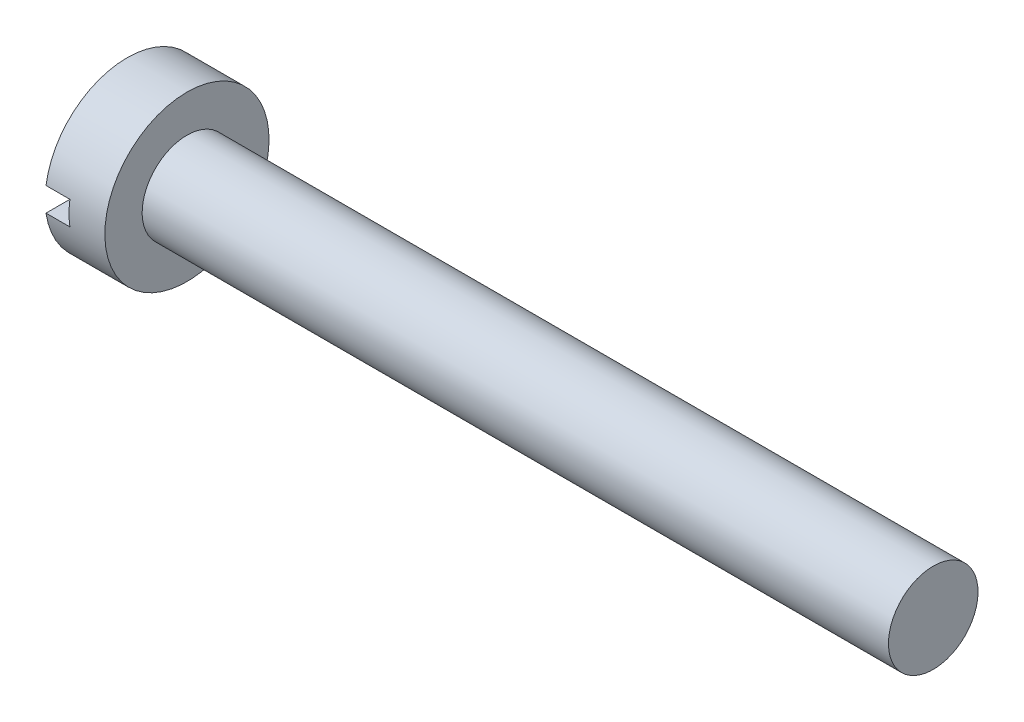
ISO-10303-21;
HEADER;
FILE_DESCRIPTION(('STEP AP214'),'2;1');
FILE_NAME('part.step','',(''),(''),'','','');
FILE_SCHEMA(('AUTOMOTIVE_DESIGN { 1 0 10303 214 1 1 1 1 }'));
ENDSEC;
DATA;
#1=APPLICATION_CONTEXT('core data for automotive mechanical design processes');
#2=APPLICATION_PROTOCOL_DEFINITION('international standard','automotive_design',2000,#1);
#3=PRODUCT_CONTEXT('',#1,'mechanical');
#4=PRODUCT('Part','Part','',(#3));
#5=PRODUCT_RELATED_PRODUCT_CATEGORY('part','',(#4));
#6=PRODUCT_DEFINITION_FORMATION('','',#4);
#7=PRODUCT_DEFINITION_CONTEXT('part definition',#1,'design');
#8=PRODUCT_DEFINITION('design','',#6,#7);
#9=PRODUCT_DEFINITION_SHAPE('','',#8);
#10=(LENGTH_UNIT() NAMED_UNIT(*) SI_UNIT(.MILLI.,.METRE.));
#11=(NAMED_UNIT(*) PLANE_ANGLE_UNIT() SI_UNIT($,.RADIAN.));
#12=(NAMED_UNIT(*) SI_UNIT($,.STERADIAN.) SOLID_ANGLE_UNIT());
#13=UNCERTAINTY_MEASURE_WITH_UNIT(LENGTH_MEASURE(1.E-05),#10,'distance_accuracy_value','');
#14=(GEOMETRIC_REPRESENTATION_CONTEXT(3) GLOBAL_UNCERTAINTY_ASSIGNED_CONTEXT((#13)) GLOBAL_UNIT_ASSIGNED_CONTEXT((#10,
#11,#12)) REPRESENTATION_CONTEXT('',''));
#15=CARTESIAN_POINT('',(0.,0.,0.));
#16=DIRECTION('',(0.,0.,1.));
#17=DIRECTION('',(1.,0.,0.));
#18=AXIS2_PLACEMENT_3D('',#15,#16,#17);
#19=CARTESIAN_POINT('',(0.,0.,0.));
#20=DIRECTION('',(-1.,0.,0.));
#21=DIRECTION('',(0.,-1.,0.));
#22=AXIS2_PLACEMENT_3D('',#19,#20,#21);
#23=PLANE('',#22);
#24=DIRECTION('',(0.,0.,-1.));
#25=VECTOR('',#24,1.);
#26=CARTESIAN_POINT('',(0.,0.399999999999997,-2.75));
#27=LINE('',#26,#25);
#28=CARTESIAN_POINT('',(0.,0.399999999999999,2.72075357208256));
#29=VERTEX_POINT('',#28);
#30=CARTESIAN_POINT('',(0.,0.399999999999997,-2.72075357208256));
#31=VERTEX_POINT('',#30);
#32=EDGE_CURVE('E83',#29,#31,#27,.T.);
#33=ORIENTED_EDGE('',*,*,#32,.F.);
#34=CARTESIAN_POINT('',(0.,0.,0.));
#35=DIRECTION('',(1.,0.,0.));
#36=DIRECTION('',(0.,1.,0.));
#37=AXIS2_PLACEMENT_3D('',#34,#35,#36);
#38=CIRCLE('',#37,2.75);
#39=EDGE_CURVE('E89',#31,#29,#38,.T.);
#40=ORIENTED_EDGE('',*,*,#39,.F.);
#41=EDGE_LOOP('',(#33,#40));
#42=FACE_BOUND('',#41,.T.);
#43=ADVANCED_FACE('F33',(#42),#23,.T.);
#44=DIRECTION('',(0.,0.,1.));
#45=VECTOR('',#44,1.);
#46=CARTESIAN_POINT('',(0.,-0.400000000000001,-2.75));
#47=LINE('',#46,#45);
#48=CARTESIAN_POINT('',(0.,-0.400000000000001,-2.72075357208256));
#49=VERTEX_POINT('',#48);
#50=CARTESIAN_POINT('',(0.,-0.399999999999999,2.72075357208256));
#51=VERTEX_POINT('',#50);
#52=EDGE_CURVE('E77',#49,#51,#47,.T.);
#53=ORIENTED_EDGE('',*,*,#52,.F.);
#54=EDGE_CURVE('E82',#51,#49,#38,.T.);
#55=ORIENTED_EDGE('',*,*,#54,.F.);
#56=EDGE_LOOP('',(#53,#55));
#57=FACE_BOUND('',#56,.T.);
#58=ADVANCED_FACE('F35',(#57),#23,.T.);
#59=CARTESIAN_POINT('',(27.,0.,0.));
#60=DIRECTION('',(1.,0.,0.));
#61=DIRECTION('',(0.,1.,0.));
#62=AXIS2_PLACEMENT_3D('',#59,#60,#61);
#63=CYLINDRICAL_SURFACE('',#62,2.75);
#64=DIRECTION('',(1.,0.,0.));
#65=VECTOR('',#64,1.);
#66=CARTESIAN_POINT('',(27.,0.399999999999997,-2.72075357208256));
#67=LINE('',#66,#65);
#68=CARTESIAN_POINT('',(0.799999999999999,0.399999999999997,-2.72075357208256));
#69=VERTEX_POINT('',#68);
#70=EDGE_CURVE('E11',#31,#69,#67,.T.);
#71=ORIENTED_EDGE('',*,*,#70,.F.);
#72=ORIENTED_EDGE('',*,*,#39,.T.);
#73=DIRECTION('',(1.,0.,0.));
#74=VECTOR('',#73,1.);
#75=CARTESIAN_POINT('',(27.,0.399999999999999,2.72075357208256));
#76=LINE('',#75,#74);
#77=CARTESIAN_POINT('',(0.799999999999999,0.399999999999999,2.72075357208256));
#78=VERTEX_POINT('',#77);
#79=EDGE_CURVE('E98',#78,#29,#76,.F.);
#80=ORIENTED_EDGE('',*,*,#79,.F.);
#81=CARTESIAN_POINT('',(0.799999999999999,0.,0.));
#82=DIRECTION('',(-1.,0.,0.));
#83=DIRECTION('',(0.,0.,1.));
#84=AXIS2_PLACEMENT_3D('',#81,#82,#83);
#85=CIRCLE('',#84,2.75);
#86=CARTESIAN_POINT('',(0.799999999999999,-0.399999999999999,2.72075357208256));
#87=VERTEX_POINT('',#86);
#88=EDGE_CURVE('E48',#78,#87,#85,.F.);
#89=ORIENTED_EDGE('',*,*,#88,.T.);
#90=DIRECTION('',(1.,0.,0.));
#91=VECTOR('',#90,1.);
#92=CARTESIAN_POINT('',(27.,-0.399999999999999,2.72075357208256));
#93=LINE('',#92,#91);
#94=EDGE_CURVE('E88',#51,#87,#93,.T.);
#95=ORIENTED_EDGE('',*,*,#94,.F.);
#96=ORIENTED_EDGE('',*,*,#54,.T.);
#97=DIRECTION('',(1.,0.,0.));
#98=VECTOR('',#97,1.);
#99=CARTESIAN_POINT('',(27.,-0.400000000000001,-2.72075357208256));
#100=LINE('',#99,#98);
#101=CARTESIAN_POINT('',(0.799999999999999,-0.400000000000001,-2.72075357208256));
#102=VERTEX_POINT('',#101);
#103=EDGE_CURVE('E41',#102,#49,#100,.F.);
#104=ORIENTED_EDGE('',*,*,#103,.F.);
#105=EDGE_CURVE('E56',#102,#69,#85,.F.);
#106=ORIENTED_EDGE('',*,*,#105,.T.);
#107=EDGE_LOOP('',(#71,#72,#80,#89,#95,#96,#104,#106));
#108=FACE_BOUND('',#107,.T.);
#109=CARTESIAN_POINT('',(2.,0.,0.));
#110=DIRECTION('',(1.,0.,0.));
#111=DIRECTION('',(0.,1.,0.));
#112=AXIS2_PLACEMENT_3D('',#109,#110,#111);
#113=CIRCLE('',#112,2.75);
#114=CARTESIAN_POINT('',(2.,2.75,0.));
#115=VERTEX_POINT('',#114);
#116=EDGE_CURVE('E93',#115,#115,#113,.T.);
#117=ORIENTED_EDGE('',*,*,#116,.F.);
#118=EDGE_LOOP('',(#117));
#119=FACE_BOUND('',#118,.T.);
#120=ADVANCED_FACE('F86',(#108,#119),#63,.T.);
#121=CARTESIAN_POINT('',(2.,2.75,0.));
#122=DIRECTION('',(1.,0.,0.));
#123=DIRECTION('',(0.,1.,0.));
#124=AXIS2_PLACEMENT_3D('',#121,#122,#123);
#125=PLANE('',#124);
#126=ORIENTED_EDGE('',*,*,#116,.T.);
#127=EDGE_LOOP('',(#126));
#128=FACE_BOUND('',#127,.T.);
#129=CARTESIAN_POINT('',(2.,0.,0.));
#130=DIRECTION('',(1.,0.,0.));
#131=DIRECTION('',(0.,1.,0.));
#132=AXIS2_PLACEMENT_3D('',#129,#130,#131);
#133=CIRCLE('',#132,1.5);
#134=CARTESIAN_POINT('',(2.,1.5,0.));
#135=VERTEX_POINT('',#134);
#136=EDGE_CURVE('E111',#135,#135,#133,.T.);
#137=ORIENTED_EDGE('',*,*,#136,.F.);
#138=EDGE_LOOP('',(#137));
#139=FACE_BOUND('',#138,.T.);
#140=ADVANCED_FACE('F118',(#128,#139),#125,.T.);
#141=CARTESIAN_POINT('',(27.,0.,0.));
#142=DIRECTION('',(1.,0.,0.));
#143=DIRECTION('',(0.,1.,0.));
#144=AXIS2_PLACEMENT_3D('',#141,#142,#143);
#145=CYLINDRICAL_SURFACE('',#144,1.5);
#146=ORIENTED_EDGE('',*,*,#136,.T.);
#147=EDGE_LOOP('',(#146));
#148=FACE_BOUND('',#147,.T.);
#149=CARTESIAN_POINT('',(27.,0.,0.));
#150=DIRECTION('',(1.,0.,0.));
#151=DIRECTION('',(0.,1.,0.));
#152=AXIS2_PLACEMENT_3D('',#149,#150,#151);
#153=CIRCLE('',#152,1.49999999999999);
#154=CARTESIAN_POINT('',(27.,1.5,0.));
#155=VERTEX_POINT('',#154);
#156=EDGE_CURVE('E109',#155,#155,#153,.T.);
#157=ORIENTED_EDGE('',*,*,#156,.F.);
#158=EDGE_LOOP('',(#157));
#159=FACE_BOUND('',#158,.T.);
#160=ADVANCED_FACE('F125',(#148,#159),#145,.T.);
#161=CARTESIAN_POINT('',(27.,1.5,0.));
#162=DIRECTION('',(1.,0.,0.));
#163=DIRECTION('',(0.,1.,0.));
#164=AXIS2_PLACEMENT_3D('',#161,#162,#163);
#165=PLANE('',#164);
#166=ORIENTED_EDGE('',*,*,#156,.T.);
#167=EDGE_LOOP('',(#166));
#168=FACE_BOUND('',#167,.T.);
#169=ADVANCED_FACE('F150',(#168),#165,.T.);
#170=CARTESIAN_POINT('',(0.8,0.399999999999997,-2.75));
#171=DIRECTION('',(0.,1.,0.));
#172=DIRECTION('',(0.,0.,1.));
#173=AXIS2_PLACEMENT_3D('',#170,#171,#172);
#174=PLANE('',#173);
#175=ORIENTED_EDGE('',*,*,#79,.T.);
#176=ORIENTED_EDGE('',*,*,#32,.T.);
#177=ORIENTED_EDGE('',*,*,#70,.T.);
#178=DIRECTION('',(0.,0.,-1.));
#179=VECTOR('',#178,1.);
#180=CARTESIAN_POINT('',(0.8,0.399999999999997,-2.75));
#181=LINE('',#180,#179);
#182=EDGE_CURVE('E105',#78,#69,#181,.T.);
#183=ORIENTED_EDGE('',*,*,#182,.F.);
#184=EDGE_LOOP('',(#175,#176,#177,#183));
#185=FACE_BOUND('',#184,.T.);
#186=ADVANCED_FACE('F145',(#185),#174,.F.);
#187=CARTESIAN_POINT('',(0.8,-0.400000000000001,-2.75));
#188=DIRECTION('',(0.,-1.,0.));
#189=DIRECTION('',(0.,0.,-1.));
#190=AXIS2_PLACEMENT_3D('',#187,#188,#189);
#191=PLANE('',#190);
#192=ORIENTED_EDGE('',*,*,#103,.T.);
#193=ORIENTED_EDGE('',*,*,#52,.T.);
#194=ORIENTED_EDGE('',*,*,#94,.T.);
#195=DIRECTION('',(0.,0.,1.));
#196=VECTOR('',#195,1.);
#197=CARTESIAN_POINT('',(0.8,-0.400000000000001,-2.75));
#198=LINE('',#197,#196);
#199=EDGE_CURVE('E78',#102,#87,#198,.T.);
#200=ORIENTED_EDGE('',*,*,#199,.F.);
#201=EDGE_LOOP('',(#192,#193,#194,#200));
#202=FACE_BOUND('',#201,.T.);
#203=ADVANCED_FACE('F76',(#202),#191,.F.);
#204=CARTESIAN_POINT('',(0.8,0.,0.));
#205=DIRECTION('',(-1.,0.,0.));
#206=DIRECTION('',(0.,0.,1.));
#207=AXIS2_PLACEMENT_3D('',#204,#205,#206);
#208=PLANE('',#207);
#209=ORIENTED_EDGE('',*,*,#199,.T.);
#210=ORIENTED_EDGE('',*,*,#88,.F.);
#211=ORIENTED_EDGE('',*,*,#182,.T.);
#212=ORIENTED_EDGE('',*,*,#105,.F.);
#213=EDGE_LOOP('',(#209,#210,#211,#212));
#214=FACE_BOUND('',#213,.T.);
#215=ADVANCED_FACE('F160',(#214),#208,.T.);
#216=CLOSED_SHELL('',(#43,#58,#120,#140,#160,#169,#186,#203,#215));
#217=MANIFOLD_SOLID_BREP('B2',#216);
#218=ADVANCED_BREP_SHAPE_REPRESENTATION('',(#18,#217),#14);
#219=SHAPE_DEFINITION_REPRESENTATION(#9,#218);
ENDSEC;
END-ISO-10303-21;
